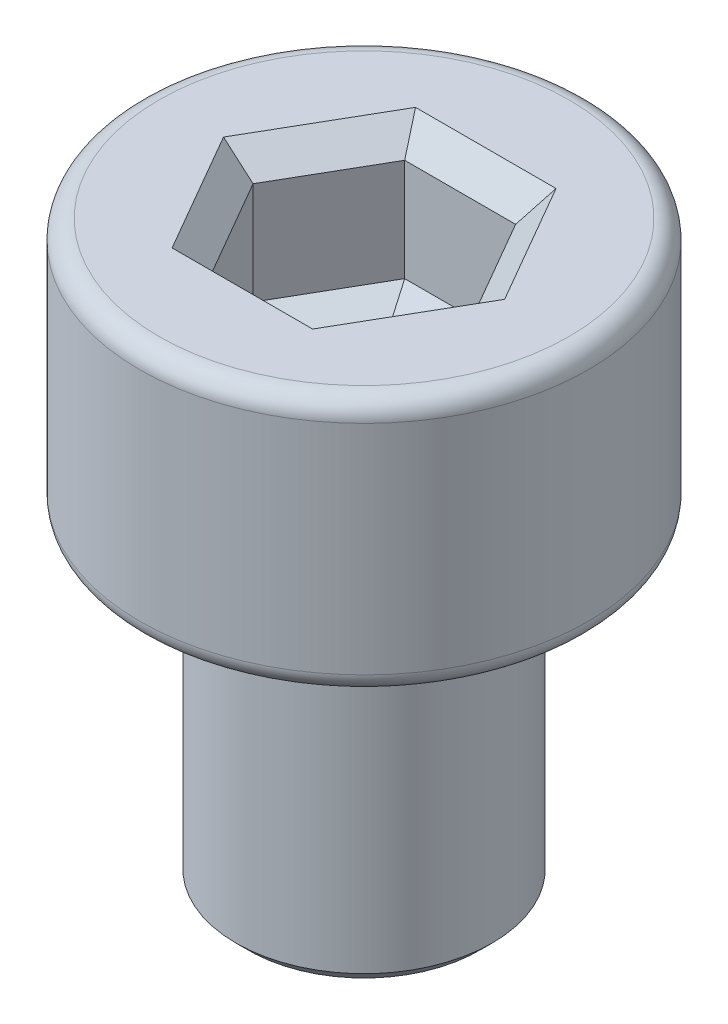
ISO-10303-21;
HEADER;
FILE_DESCRIPTION(('STEP AP214'),'2;1');
FILE_NAME('part.step','',(''),(''),'','','');
FILE_SCHEMA(('AUTOMOTIVE_DESIGN { 1 0 10303 214 1 1 1 1 }'));
ENDSEC;
DATA;
#1=APPLICATION_CONTEXT('core data for automotive mechanical design processes');
#2=APPLICATION_PROTOCOL_DEFINITION('international standard','automotive_design',2000,#1);
#3=PRODUCT_CONTEXT('',#1,'mechanical');
#4=PRODUCT('Part','Part','',(#3));
#5=PRODUCT_RELATED_PRODUCT_CATEGORY('part','',(#4));
#6=PRODUCT_DEFINITION_FORMATION('','',#4);
#7=PRODUCT_DEFINITION_CONTEXT('part definition',#1,'design');
#8=PRODUCT_DEFINITION('design','',#6,#7);
#9=PRODUCT_DEFINITION_SHAPE('','',#8);
#10=(LENGTH_UNIT() NAMED_UNIT(*) SI_UNIT(.MILLI.,.METRE.));
#11=(NAMED_UNIT(*) PLANE_ANGLE_UNIT() SI_UNIT($,.RADIAN.));
#12=(NAMED_UNIT(*) SI_UNIT($,.STERADIAN.) SOLID_ANGLE_UNIT());
#13=UNCERTAINTY_MEASURE_WITH_UNIT(LENGTH_MEASURE(1.E-05),#10,'distance_accuracy_value','');
#14=(GEOMETRIC_REPRESENTATION_CONTEXT(3) GLOBAL_UNCERTAINTY_ASSIGNED_CONTEXT((#13)) GLOBAL_UNIT_ASSIGNED_CONTEXT((#10,
#11,#12)) REPRESENTATION_CONTEXT('',''));
#15=CARTESIAN_POINT('',(0.,0.,0.));
#16=DIRECTION('',(0.,0.,1.));
#17=DIRECTION('',(1.,0.,0.));
#18=AXIS2_PLACEMENT_3D('',#15,#16,#17);
#19=CARTESIAN_POINT('',(0.,4.,0.));
#20=DIRECTION('',(0.,-1.,0.));
#21=DIRECTION('',(0.,0.,-1.));
#22=AXIS2_PLACEMENT_3D('',#19,#20,#21);
#23=CYLINDRICAL_SURFACE('',#22,3.5);
#24=CARTESIAN_POINT('',(0.,0.3,0.));
#25=DIRECTION('',(0.,1.,0.));
#26=DIRECTION('',(0.,0.,1.));
#27=AXIS2_PLACEMENT_3D('',#24,#25,#26);
#28=CIRCLE('',#27,3.5);
#29=CARTESIAN_POINT('',(0.,0.3,3.5));
#30=VERTEX_POINT('',#29);
#31=EDGE_CURVE('E217',#30,#30,#28,.T.);
#32=ORIENTED_EDGE('',*,*,#31,.T.);
#33=EDGE_LOOP('',(#32));
#34=FACE_BOUND('',#33,.T.);
#35=CARTESIAN_POINT('',(0.,3.7,0.));
#36=DIRECTION('',(0.,1.,0.));
#37=DIRECTION('',(0.,0.,1.));
#38=AXIS2_PLACEMENT_3D('',#35,#36,#37);
#39=CIRCLE('',#38,3.5);
#40=CARTESIAN_POINT('',(0.,3.7,3.5));
#41=VERTEX_POINT('',#40);
#42=EDGE_CURVE('E200',#41,#41,#39,.F.);
#43=ORIENTED_EDGE('',*,*,#42,.T.);
#44=EDGE_LOOP('',(#43));
#45=FACE_BOUND('',#44,.T.);
#46=ADVANCED_FACE('F41',(#34,#45),#23,.T.);
#47=CARTESIAN_POINT('',(0.,4.,0.));
#48=DIRECTION('',(0.,1.,0.));
#49=DIRECTION('',(0.,0.,1.));
#50=AXIS2_PLACEMENT_3D('',#47,#48,#49);
#51=PLANE('',#50);
#52=CARTESIAN_POINT('',(0.,4.,0.));
#53=DIRECTION('',(0.,1.,0.));
#54=DIRECTION('',(0.,0.,1.));
#55=AXIS2_PLACEMENT_3D('',#52,#53,#54);
#56=CIRCLE('',#55,3.2);
#57=CARTESIAN_POINT('',(0.,4.,3.2));
#58=VERTEX_POINT('',#57);
#59=EDGE_CURVE('E221',#58,#58,#56,.T.);
#60=ORIENTED_EDGE('',*,*,#59,.T.);
#61=EDGE_LOOP('',(#60));
#62=FACE_BOUND('',#61,.T.);
#63=DIRECTION('',(-0.5,0.,-0.866025403784439));
#64=VECTOR('',#63,1.);
#65=CARTESIAN_POINT('',(-2.07846096908265,4.,0.199999999999999));
#66=LINE('',#65,#64);
#67=CARTESIAN_POINT('',(-1.09696551146029,4.,1.9));
#68=VERTEX_POINT('',#67);
#69=CARTESIAN_POINT('',(-2.19393102292058,4.,0.));
#70=VERTEX_POINT('',#69);
#71=EDGE_CURVE('E180',#68,#70,#66,.T.);
#72=ORIENTED_EDGE('',*,*,#71,.T.);
#73=DIRECTION('',(0.5,0.,-0.866025403784439));
#74=VECTOR('',#73,1.);
#75=CARTESIAN_POINT('',(-1.21243556529821,4.,-1.7));
#76=LINE('',#75,#74);
#77=CARTESIAN_POINT('',(-1.09696551146029,4.,-1.9));
#78=VERTEX_POINT('',#77);
#79=EDGE_CURVE('E190',#70,#78,#76,.T.);
#80=ORIENTED_EDGE('',*,*,#79,.T.);
#81=DIRECTION('',(1.,0.,0.));
#82=VECTOR('',#81,1.);
#83=CARTESIAN_POINT('',(0.866025403784438,4.,-1.9));
#84=LINE('',#83,#82);
#85=CARTESIAN_POINT('',(1.09696551146029,4.,-1.9));
#86=VERTEX_POINT('',#85);
#87=EDGE_CURVE('E184',#78,#86,#84,.T.);
#88=ORIENTED_EDGE('',*,*,#87,.T.);
#89=DIRECTION('',(0.5,0.,0.866025403784439));
#90=VECTOR('',#89,1.);
#91=CARTESIAN_POINT('',(2.07846096908265,4.,-0.2));
#92=LINE('',#91,#90);
#93=CARTESIAN_POINT('',(2.19393102292058,4.,0.));
#94=VERTEX_POINT('',#93);
#95=EDGE_CURVE('E182',#86,#94,#92,.T.);
#96=ORIENTED_EDGE('',*,*,#95,.T.);
#97=DIRECTION('',(-0.5,0.,0.866025403784439));
#98=VECTOR('',#97,1.);
#99=CARTESIAN_POINT('',(1.21243556529821,4.,1.7));
#100=LINE('',#99,#98);
#101=CARTESIAN_POINT('',(1.09696551146029,4.,1.9));
#102=VERTEX_POINT('',#101);
#103=EDGE_CURVE('E181',#94,#102,#100,.T.);
#104=ORIENTED_EDGE('',*,*,#103,.T.);
#105=DIRECTION('',(-1.,0.,0.));
#106=VECTOR('',#105,1.);
#107=CARTESIAN_POINT('',(-0.866025403784438,4.,1.9));
#108=LINE('',#107,#106);
#109=EDGE_CURVE('E177',#102,#68,#108,.T.);
#110=ORIENTED_EDGE('',*,*,#109,.T.);
#111=EDGE_LOOP('',(#72,#80,#88,#96,#104,#110));
#112=FACE_BOUND('',#111,.T.);
#113=ADVANCED_FACE('F246',(#62,#112),#51,.T.);
#114=CARTESIAN_POINT('',(0.,0.,0.));
#115=DIRECTION('',(0.,1.,0.));
#116=DIRECTION('',(0.,0.,1.));
#117=AXIS2_PLACEMENT_3D('',#114,#115,#116);
#118=PLANE('',#117);
#119=CARTESIAN_POINT('',(0.,0.,0.));
#120=DIRECTION('',(0.,1.,0.));
#121=DIRECTION('',(0.,0.,1.));
#122=AXIS2_PLACEMENT_3D('',#119,#120,#121);
#123=CIRCLE('',#122,2.2);
#124=CARTESIAN_POINT('',(0.,0.,2.2));
#125=VERTEX_POINT('',#124);
#126=EDGE_CURVE('E226',#125,#125,#123,.T.);
#127=ORIENTED_EDGE('',*,*,#126,.T.);
#128=EDGE_LOOP('',(#127));
#129=FACE_BOUND('',#128,.T.);
#130=CARTESIAN_POINT('',(0.,0.,0.));
#131=DIRECTION('',(0.,1.,0.));
#132=DIRECTION('',(0.,0.,1.));
#133=AXIS2_PLACEMENT_3D('',#130,#131,#132);
#134=CIRCLE('',#133,3.2);
#135=CARTESIAN_POINT('',(0.,0.,3.2));
#136=VERTEX_POINT('',#135);
#137=EDGE_CURVE('E216',#136,#136,#134,.F.);
#138=ORIENTED_EDGE('',*,*,#137,.T.);
#139=EDGE_LOOP('',(#138));
#140=FACE_BOUND('',#139,.T.);
#141=ADVANCED_FACE('F254',(#129,#140),#118,.F.);
#142=CARTESIAN_POINT('',(0.866025403784438,2.,1.5));
#143=DIRECTION('',(0.866025403784439,0.,0.5));
#144=DIRECTION('',(0.5,0.,-0.866025403784439));
#145=AXIS2_PLACEMENT_3D('',#142,#143,#144);
#146=PLANE('',#145);
#147=DIRECTION('',(0.,1.,0.));
#148=VECTOR('',#147,1.);
#149=CARTESIAN_POINT('',(0.866025403784438,2.,1.5));
#150=LINE('',#149,#148);
#151=CARTESIAN_POINT('',(0.866025403784438,2.,1.5));
#152=VERTEX_POINT('',#151);
#153=CARTESIAN_POINT('',(0.866025403784438,3.6,1.5));
#154=VERTEX_POINT('',#153);
#155=EDGE_CURVE('E138',#152,#154,#150,.T.);
#156=ORIENTED_EDGE('',*,*,#155,.T.);
#157=DIRECTION('',(0.5,0.,-0.866025403784439));
#158=VECTOR('',#157,1.);
#159=CARTESIAN_POINT('',(1.73205080756888,3.6,0.));
#160=LINE('',#159,#158);
#161=CARTESIAN_POINT('',(1.73205080756888,3.6,0.));
#162=VERTEX_POINT('',#161);
#163=EDGE_CURVE('E193',#154,#162,#160,.T.);
#164=ORIENTED_EDGE('',*,*,#163,.T.);
#165=DIRECTION('',(0.,1.,0.));
#166=VECTOR('',#165,1.);
#167=CARTESIAN_POINT('',(1.73205080756888,2.,0.));
#168=LINE('',#167,#166);
#169=CARTESIAN_POINT('',(1.73205080756888,2.,0.));
#170=VERTEX_POINT('',#169);
#171=EDGE_CURVE('E139',#170,#162,#168,.T.);
#172=ORIENTED_EDGE('',*,*,#171,.F.);
#173=DIRECTION('',(0.5,0.,-0.866025403784439));
#174=VECTOR('',#173,1.);
#175=CARTESIAN_POINT('',(0.866025403784438,2.,1.5));
#176=LINE('',#175,#174);
#177=EDGE_CURVE('E121',#152,#170,#176,.T.);
#178=ORIENTED_EDGE('',*,*,#177,.F.);
#179=EDGE_LOOP('',(#156,#164,#172,#178));
#180=FACE_BOUND('',#179,.T.);
#181=ADVANCED_FACE('F146',(#180),#146,.F.);
#182=CARTESIAN_POINT('',(-0.866025403784438,2.,1.5));
#183=DIRECTION('',(0.,0.,1.));
#184=DIRECTION('',(1.,0.,0.));
#185=AXIS2_PLACEMENT_3D('',#182,#183,#184);
#186=PLANE('',#185);
#187=DIRECTION('',(0.,1.,0.));
#188=VECTOR('',#187,1.);
#189=CARTESIAN_POINT('',(-0.866025403784438,2.,1.5));
#190=LINE('',#189,#188);
#191=CARTESIAN_POINT('',(-0.866025403784438,2.,1.5));
#192=VERTEX_POINT('',#191);
#193=CARTESIAN_POINT('',(-0.866025403784438,3.6,1.5));
#194=VERTEX_POINT('',#193);
#195=EDGE_CURVE('E144',#192,#194,#190,.T.);
#196=ORIENTED_EDGE('',*,*,#195,.T.);
#197=DIRECTION('',(1.,0.,0.));
#198=VECTOR('',#197,1.);
#199=CARTESIAN_POINT('',(0.866025403784438,3.6,1.5));
#200=LINE('',#199,#198);
#201=EDGE_CURVE('E63',#194,#154,#200,.T.);
#202=ORIENTED_EDGE('',*,*,#201,.T.);
#203=ORIENTED_EDGE('',*,*,#155,.F.);
#204=DIRECTION('',(1.,0.,0.));
#205=VECTOR('',#204,1.);
#206=CARTESIAN_POINT('',(-0.866025403784438,2.,1.5));
#207=LINE('',#206,#205);
#208=EDGE_CURVE('E135',#192,#152,#207,.T.);
#209=ORIENTED_EDGE('',*,*,#208,.F.);
#210=EDGE_LOOP('',(#196,#202,#203,#209));
#211=FACE_BOUND('',#210,.T.);
#212=ADVANCED_FACE('F137',(#211),#186,.F.);
#213=CARTESIAN_POINT('',(-1.73205080756888,2.,0.));
#214=DIRECTION('',(-0.866025403784438,0.,0.5));
#215=DIRECTION('',(0.5,0.,0.866025403784439));
#216=AXIS2_PLACEMENT_3D('',#213,#214,#215);
#217=PLANE('',#216);
#218=DIRECTION('',(0.,1.,0.));
#219=VECTOR('',#218,1.);
#220=CARTESIAN_POINT('',(-1.73205080756888,2.,0.));
#221=LINE('',#220,#219);
#222=CARTESIAN_POINT('',(-1.73205080756888,2.,0.));
#223=VERTEX_POINT('',#222);
#224=CARTESIAN_POINT('',(-1.73205080756888,3.6,0.));
#225=VERTEX_POINT('',#224);
#226=EDGE_CURVE('E168',#223,#225,#221,.T.);
#227=ORIENTED_EDGE('',*,*,#226,.T.);
#228=DIRECTION('',(0.5,0.,0.866025403784439));
#229=VECTOR('',#228,1.);
#230=CARTESIAN_POINT('',(-0.866025403784438,3.6,1.5));
#231=LINE('',#230,#229);
#232=EDGE_CURVE('E60',#225,#194,#231,.T.);
#233=ORIENTED_EDGE('',*,*,#232,.T.);
#234=ORIENTED_EDGE('',*,*,#195,.F.);
#235=DIRECTION('',(0.5,0.,0.866025403784438));
#236=VECTOR('',#235,1.);
#237=CARTESIAN_POINT('',(-1.73205080756888,2.,0.));
#238=LINE('',#237,#236);
#239=EDGE_CURVE('E136',#223,#192,#238,.T.);
#240=ORIENTED_EDGE('',*,*,#239,.F.);
#241=EDGE_LOOP('',(#227,#233,#234,#240));
#242=FACE_BOUND('',#241,.T.);
#243=ADVANCED_FACE('F329',(#242),#217,.F.);
#244=CARTESIAN_POINT('',(-0.866025403784439,2.,-1.5));
#245=DIRECTION('',(-0.866025403784439,0.,-0.5));
#246=DIRECTION('',(-0.5,0.,0.866025403784439));
#247=AXIS2_PLACEMENT_3D('',#244,#245,#246);
#248=PLANE('',#247);
#249=DIRECTION('',(0.,1.,0.));
#250=VECTOR('',#249,1.);
#251=CARTESIAN_POINT('',(-0.866025403784439,2.,-1.5));
#252=LINE('',#251,#250);
#253=CARTESIAN_POINT('',(-0.866025403784439,2.,-1.5));
#254=VERTEX_POINT('',#253);
#255=CARTESIAN_POINT('',(-0.866025403784439,3.6,-1.5));
#256=VERTEX_POINT('',#255);
#257=EDGE_CURVE('E166',#254,#256,#252,.T.);
#258=ORIENTED_EDGE('',*,*,#257,.T.);
#259=DIRECTION('',(-0.5,0.,0.866025403784439));
#260=VECTOR('',#259,1.);
#261=CARTESIAN_POINT('',(-1.73205080756888,3.6,0.));
#262=LINE('',#261,#260);
#263=EDGE_CURVE('E141',#256,#225,#262,.T.);
#264=ORIENTED_EDGE('',*,*,#263,.T.);
#265=ORIENTED_EDGE('',*,*,#226,.F.);
#266=DIRECTION('',(-0.5,0.,0.866025403784439));
#267=VECTOR('',#266,1.);
#268=CARTESIAN_POINT('',(-0.866025403784439,2.,-1.5));
#269=LINE('',#268,#267);
#270=EDGE_CURVE('E163',#254,#223,#269,.T.);
#271=ORIENTED_EDGE('',*,*,#270,.F.);
#272=EDGE_LOOP('',(#258,#264,#265,#271));
#273=FACE_BOUND('',#272,.T.);
#274=ADVANCED_FACE('F324',(#273),#248,.F.);
#275=CARTESIAN_POINT('',(0.866025403784438,2.,-1.5));
#276=DIRECTION('',(0.,0.,-1.));
#277=DIRECTION('',(-1.,0.,0.));
#278=AXIS2_PLACEMENT_3D('',#275,#276,#277);
#279=PLANE('',#278);
#280=DIRECTION('',(0.,1.,0.));
#281=VECTOR('',#280,1.);
#282=CARTESIAN_POINT('',(0.866025403784438,2.,-1.5));
#283=LINE('',#282,#281);
#284=CARTESIAN_POINT('',(0.866025403784438,2.,-1.5));
#285=VERTEX_POINT('',#284);
#286=CARTESIAN_POINT('',(0.866025403784438,3.6,-1.5));
#287=VERTEX_POINT('',#286);
#288=EDGE_CURVE('E171',#285,#287,#283,.T.);
#289=ORIENTED_EDGE('',*,*,#288,.T.);
#290=DIRECTION('',(-1.,0.,0.));
#291=VECTOR('',#290,1.);
#292=CARTESIAN_POINT('',(-0.866025403784439,3.6,-1.5));
#293=LINE('',#292,#291);
#294=EDGE_CURVE('E188',#287,#256,#293,.T.);
#295=ORIENTED_EDGE('',*,*,#294,.T.);
#296=ORIENTED_EDGE('',*,*,#257,.F.);
#297=DIRECTION('',(-1.,0.,0.));
#298=VECTOR('',#297,1.);
#299=CARTESIAN_POINT('',(0.866025403784438,2.,-1.5));
#300=LINE('',#299,#298);
#301=EDGE_CURVE('E154',#285,#254,#300,.T.);
#302=ORIENTED_EDGE('',*,*,#301,.F.);
#303=EDGE_LOOP('',(#289,#295,#296,#302));
#304=FACE_BOUND('',#303,.T.);
#305=ADVANCED_FACE('F338',(#304),#279,.F.);
#306=CARTESIAN_POINT('',(1.73205080756888,2.,0.));
#307=DIRECTION('',(0.866025403784438,0.,-0.5));
#308=DIRECTION('',(-0.5,0.,-0.866025403784439));
#309=AXIS2_PLACEMENT_3D('',#306,#307,#308);
#310=PLANE('',#309);
#311=ORIENTED_EDGE('',*,*,#171,.T.);
#312=DIRECTION('',(-0.5,0.,-0.866025403784439));
#313=VECTOR('',#312,1.);
#314=CARTESIAN_POINT('',(0.866025403784438,3.6,-1.5));
#315=LINE('',#314,#313);
#316=EDGE_CURVE('E192',#162,#287,#315,.T.);
#317=ORIENTED_EDGE('',*,*,#316,.T.);
#318=ORIENTED_EDGE('',*,*,#288,.F.);
#319=DIRECTION('',(-0.5,0.,-0.866025403784438));
#320=VECTOR('',#319,1.);
#321=CARTESIAN_POINT('',(1.73205080756888,2.,0.));
#322=LINE('',#321,#320);
#323=EDGE_CURVE('E148',#170,#285,#322,.T.);
#324=ORIENTED_EDGE('',*,*,#323,.F.);
#325=EDGE_LOOP('',(#311,#317,#318,#324));
#326=FACE_BOUND('',#325,.T.);
#327=ADVANCED_FACE('F348',(#326),#310,.F.);
#328=CARTESIAN_POINT('',(-0.866025403784438,2.,1.5));
#329=DIRECTION('',(0.,-0.939692620785909,0.342020143325666));
#330=DIRECTION('',(0.,-0.342020143325666,-0.939692620785909));
#331=AXIS2_PLACEMENT_3D('',#328,#329,#330);
#332=PLANE('',#331);
#333=ORIENTED_EDGE('',*,*,#208,.T.);
#334=DIRECTION('',(0.476870962711474,0.30062657848322,0.825964736070557));
#335=VECTOR('',#334,1.);
#336=CARTESIAN_POINT('',(0.472146804928744,1.75169304744731,0.817782254767896));
#337=LINE('',#336,#335);
#338=CARTESIAN_POINT('',(0.,1.4540446486007,0.));
#339=VERTEX_POINT('',#338);
#340=EDGE_CURVE('E119',#339,#152,#337,.T.);
#341=ORIENTED_EDGE('',*,*,#340,.F.);
#342=DIRECTION('',(-0.476870962711474,0.30062657848322,0.825964736070557));
#343=VECTOR('',#342,1.);
#344=CARTESIAN_POINT('',(-0.472146804928744,1.75169304744731,0.817782254767895));
#345=LINE('',#344,#343);
#346=EDGE_CURVE('E133',#339,#192,#345,.T.);
#347=ORIENTED_EDGE('',*,*,#346,.T.);
#348=EDGE_LOOP('',(#333,#341,#347));
#349=FACE_BOUND('',#348,.T.);
#350=ADVANCED_FACE('F131',(#349),#332,.F.);
#351=CARTESIAN_POINT('',(-1.73205080756888,2.,0.));
#352=DIRECTION('',(-0.296198132726022,-0.939692620785909,0.171010071662833));
#353=DIRECTION('',(0.953741925422948,-0.30062657848322,0.));
#354=AXIS2_PLACEMENT_3D('',#351,#352,#353);
#355=PLANE('',#354);
#356=ORIENTED_EDGE('',*,*,#239,.T.);
#357=ORIENTED_EDGE('',*,*,#346,.F.);
#358=DIRECTION('',(-0.953741925422948,0.30062657848322,0.));
#359=VECTOR('',#358,1.);
#360=CARTESIAN_POINT('',(-0.944293609857488,1.75169304744731,0.));
#361=LINE('',#360,#359);
#362=EDGE_CURVE('E151',#339,#223,#361,.T.);
#363=ORIENTED_EDGE('',*,*,#362,.T.);
#364=EDGE_LOOP('',(#356,#357,#363));
#365=FACE_BOUND('',#364,.T.);
#366=ADVANCED_FACE('F326',(#365),#355,.F.);
#367=CARTESIAN_POINT('',(-0.866025403784439,2.,-1.5));
#368=DIRECTION('',(-0.296198132726022,-0.939692620785909,-0.171010071662833));
#369=DIRECTION('',(0.953741925422948,-0.30062657848322,0.));
#370=AXIS2_PLACEMENT_3D('',#367,#368,#369);
#371=PLANE('',#370);
#372=ORIENTED_EDGE('',*,*,#270,.T.);
#373=ORIENTED_EDGE('',*,*,#362,.F.);
#374=DIRECTION('',(-0.476870962711474,0.30062657848322,-0.825964736070557));
#375=VECTOR('',#374,1.);
#376=CARTESIAN_POINT('',(-0.472146804928745,1.75169304744731,-0.817782254767896));
#377=LINE('',#376,#375);
#378=EDGE_CURVE('E331',#339,#254,#377,.T.);
#379=ORIENTED_EDGE('',*,*,#378,.T.);
#380=EDGE_LOOP('',(#372,#373,#379));
#381=FACE_BOUND('',#380,.T.);
#382=ADVANCED_FACE('F335',(#381),#371,.F.);
#383=CARTESIAN_POINT('',(0.866025403784438,2.,-1.5));
#384=DIRECTION('',(0.,-0.939692620785909,-0.342020143325666));
#385=DIRECTION('',(0.,0.342020143325666,-0.939692620785909));
#386=AXIS2_PLACEMENT_3D('',#383,#384,#385);
#387=PLANE('',#386);
#388=ORIENTED_EDGE('',*,*,#301,.T.);
#389=ORIENTED_EDGE('',*,*,#378,.F.);
#390=DIRECTION('',(0.476870962711474,0.30062657848322,-0.825964736070557));
#391=VECTOR('',#390,1.);
#392=CARTESIAN_POINT('',(0.472146804928743,1.75169304744731,-0.817782254767896));
#393=LINE('',#392,#391);
#394=EDGE_CURVE('E337',#339,#285,#393,.T.);
#395=ORIENTED_EDGE('',*,*,#394,.T.);
#396=EDGE_LOOP('',(#388,#389,#395));
#397=FACE_BOUND('',#396,.T.);
#398=ADVANCED_FACE('F336',(#397),#387,.F.);
#399=CARTESIAN_POINT('',(1.73205080756888,2.,0.));
#400=DIRECTION('',(0.296198132726022,-0.939692620785909,-0.171010071662833));
#401=DIRECTION('',(0.953741925422948,0.30062657848322,0.));
#402=AXIS2_PLACEMENT_3D('',#399,#400,#401);
#403=PLANE('',#402);
#404=ORIENTED_EDGE('',*,*,#323,.T.);
#405=ORIENTED_EDGE('',*,*,#394,.F.);
#406=DIRECTION('',(0.953741925422948,0.30062657848322,0.));
#407=VECTOR('',#406,1.);
#408=CARTESIAN_POINT('',(0.944293609857487,1.75169304744731,0.));
#409=LINE('',#408,#407);
#410=EDGE_CURVE('E126',#339,#170,#409,.T.);
#411=ORIENTED_EDGE('',*,*,#410,.T.);
#412=EDGE_LOOP('',(#404,#405,#411));
#413=FACE_BOUND('',#412,.T.);
#414=ADVANCED_FACE('F351',(#413),#403,.F.);
#415=CARTESIAN_POINT('',(0.866025403784438,2.,1.5));
#416=DIRECTION('',(0.296198132726022,-0.939692620785909,0.171010071662833));
#417=DIRECTION('',(0.953741925422948,0.30062657848322,0.));
#418=AXIS2_PLACEMENT_3D('',#415,#416,#417);
#419=PLANE('',#418);
#420=ORIENTED_EDGE('',*,*,#177,.T.);
#421=ORIENTED_EDGE('',*,*,#410,.F.);
#422=ORIENTED_EDGE('',*,*,#340,.T.);
#423=EDGE_LOOP('',(#420,#421,#422));
#424=FACE_BOUND('',#423,.T.);
#425=ADVANCED_FACE('F125',(#424),#419,.F.);
#426=CARTESIAN_POINT('',(0.,-5.,0.));
#427=DIRECTION('',(0.,1.,0.));
#428=DIRECTION('',(0.,0.,1.));
#429=AXIS2_PLACEMENT_3D('',#426,#427,#428);
#430=CYLINDRICAL_SURFACE('',#429,2.);
#431=CARTESIAN_POINT('',(0.,-4.8,0.));
#432=DIRECTION('',(0.,-1.,0.));
#433=DIRECTION('',(0.,0.,-1.));
#434=AXIS2_PLACEMENT_3D('',#431,#432,#433);
#435=CIRCLE('',#434,2.);
#436=CARTESIAN_POINT('',(0.,-4.8,-2.));
#437=VERTEX_POINT('',#436);
#438=EDGE_CURVE('E11',#437,#437,#435,.F.);
#439=ORIENTED_EDGE('',*,*,#438,.T.);
#440=EDGE_LOOP('',(#439));
#441=FACE_BOUND('',#440,.T.);
#442=CARTESIAN_POINT('',(0.,-0.2,0.));
#443=DIRECTION('',(0.,1.,0.));
#444=DIRECTION('',(0.,0.,1.));
#445=AXIS2_PLACEMENT_3D('',#442,#443,#444);
#446=CIRCLE('',#445,2.);
#447=CARTESIAN_POINT('',(0.,-0.2,2.));
#448=VERTEX_POINT('',#447);
#449=EDGE_CURVE('E222',#448,#448,#446,.F.);
#450=ORIENTED_EDGE('',*,*,#449,.T.);
#451=EDGE_LOOP('',(#450));
#452=FACE_BOUND('',#451,.T.);
#453=ADVANCED_FACE('F363',(#441,#452),#430,.T.);
#454=CARTESIAN_POINT('',(0.,-5.,0.));
#455=DIRECTION('',(0.,-1.,0.));
#456=DIRECTION('',(0.,0.,-1.));
#457=AXIS2_PLACEMENT_3D('',#454,#455,#456);
#458=PLANE('',#457);
#459=CARTESIAN_POINT('',(0.,-5.,0.));
#460=DIRECTION('',(0.,-1.,0.));
#461=DIRECTION('',(0.,0.,-1.));
#462=AXIS2_PLACEMENT_3D('',#459,#460,#461);
#463=CIRCLE('',#462,1.8);
#464=CARTESIAN_POINT('',(0.,-5.,-1.8));
#465=VERTEX_POINT('',#464);
#466=EDGE_CURVE('E49',#465,#465,#463,.T.);
#467=ORIENTED_EDGE('',*,*,#466,.T.);
#468=EDGE_LOOP('',(#467));
#469=FACE_BOUND('',#468,.T.);
#470=ADVANCED_FACE('F231',(#469),#458,.T.);
#471=CARTESIAN_POINT('',(0.866025403784438,3.6,1.5));
#472=DIRECTION('',(-0.612372435695793,0.70710678118655,-0.353553390593273));
#473=DIRECTION('',(-0.5,0.,0.866025403784439));
#474=AXIS2_PLACEMENT_3D('',#471,#472,#473);
#475=PLANE('',#474);
#476=DIRECTION('',(-0.377964473009229,-0.654653670707975,-0.654653670707978));
#477=VECTOR('',#476,1.);
#478=CARTESIAN_POINT('',(0.866025403784438,3.6,1.5));
#479=LINE('',#478,#477);
#480=EDGE_CURVE('E209',#102,#154,#479,.T.);
#481=ORIENTED_EDGE('',*,*,#480,.F.);
#482=ORIENTED_EDGE('',*,*,#103,.F.);
#483=DIRECTION('',(-0.755928946018456,-0.654653670707975,0.));
#484=VECTOR('',#483,1.);
#485=CARTESIAN_POINT('',(1.73205080756888,3.6,0.));
#486=LINE('',#485,#484);
#487=EDGE_CURVE('E130',#162,#94,#486,.F.);
#488=ORIENTED_EDGE('',*,*,#487,.F.);
#489=ORIENTED_EDGE('',*,*,#163,.F.);
#490=EDGE_LOOP('',(#481,#482,#488,#489));
#491=FACE_BOUND('',#490,.T.);
#492=ADVANCED_FACE('F295',(#491),#475,.T.);
#493=CARTESIAN_POINT('',(1.73205080756888,3.6,0.));
#494=DIRECTION('',(-0.612372435695793,0.707106781186549,0.353553390593273));
#495=DIRECTION('',(0.5,0.,0.866025403784439));
#496=AXIS2_PLACEMENT_3D('',#493,#494,#495);
#497=PLANE('',#496);
#498=ORIENTED_EDGE('',*,*,#487,.T.);
#499=ORIENTED_EDGE('',*,*,#95,.F.);
#500=DIRECTION('',(-0.377964473009228,-0.654653670707976,0.654653670707979));
#501=VECTOR('',#500,1.);
#502=CARTESIAN_POINT('',(0.866025403784438,3.6,-1.5));
#503=LINE('',#502,#501);
#504=EDGE_CURVE('E207',#287,#86,#503,.F.);
#505=ORIENTED_EDGE('',*,*,#504,.F.);
#506=ORIENTED_EDGE('',*,*,#316,.F.);
#507=EDGE_LOOP('',(#498,#499,#505,#506));
#508=FACE_BOUND('',#507,.T.);
#509=ADVANCED_FACE('F286',(#508),#497,.T.);
#510=CARTESIAN_POINT('',(-0.866025403784438,3.6,1.5));
#511=DIRECTION('',(0.,0.707106781186549,-0.707106781186546));
#512=DIRECTION('',(-1.,0.,0.));
#513=AXIS2_PLACEMENT_3D('',#510,#511,#512);
#514=PLANE('',#513);
#515=ORIENTED_EDGE('',*,*,#480,.T.);
#516=ORIENTED_EDGE('',*,*,#201,.F.);
#517=DIRECTION('',(0.377964473009228,-0.654653670707975,-0.654653670707978));
#518=VECTOR('',#517,1.);
#519=CARTESIAN_POINT('',(-0.866025403784438,3.6,1.5));
#520=LINE('',#519,#518);
#521=EDGE_CURVE('E205',#68,#194,#520,.T.);
#522=ORIENTED_EDGE('',*,*,#521,.F.);
#523=ORIENTED_EDGE('',*,*,#109,.F.);
#524=EDGE_LOOP('',(#515,#516,#522,#523));
#525=FACE_BOUND('',#524,.T.);
#526=ADVANCED_FACE('F280',(#525),#514,.T.);
#527=CARTESIAN_POINT('',(0.866025403784438,3.6,-1.5));
#528=DIRECTION('',(0.,0.707106781186549,0.707106781186546));
#529=DIRECTION('',(1.,0.,0.));
#530=AXIS2_PLACEMENT_3D('',#527,#528,#529);
#531=PLANE('',#530);
#532=ORIENTED_EDGE('',*,*,#504,.T.);
#533=ORIENTED_EDGE('',*,*,#87,.F.);
#534=DIRECTION('',(0.377964473009228,-0.654653670707975,0.654653670707978));
#535=VECTOR('',#534,1.);
#536=CARTESIAN_POINT('',(-0.866025403784439,3.6,-1.5));
#537=LINE('',#536,#535);
#538=EDGE_CURVE('E204',#256,#78,#537,.F.);
#539=ORIENTED_EDGE('',*,*,#538,.F.);
#540=ORIENTED_EDGE('',*,*,#294,.F.);
#541=EDGE_LOOP('',(#532,#533,#539,#540));
#542=FACE_BOUND('',#541,.T.);
#543=ADVANCED_FACE('F271',(#542),#531,.T.);
#544=CARTESIAN_POINT('',(-1.73205080756888,3.6,0.));
#545=DIRECTION('',(0.612372435695793,0.707106781186549,-0.353553390593273));
#546=DIRECTION('',(-0.5,0.,-0.866025403784439));
#547=AXIS2_PLACEMENT_3D('',#544,#545,#546);
#548=PLANE('',#547);
#549=ORIENTED_EDGE('',*,*,#521,.T.);
#550=ORIENTED_EDGE('',*,*,#232,.F.);
#551=DIRECTION('',(-0.755928946018456,0.654653670707975,0.));
#552=VECTOR('',#551,1.);
#553=CARTESIAN_POINT('',(-1.23717914826348,3.17142857142857,0.));
#554=LINE('',#553,#552);
#555=EDGE_CURVE('E196',#70,#225,#554,.F.);
#556=ORIENTED_EDGE('',*,*,#555,.F.);
#557=ORIENTED_EDGE('',*,*,#71,.F.);
#558=EDGE_LOOP('',(#549,#550,#556,#557));
#559=FACE_BOUND('',#558,.T.);
#560=ADVANCED_FACE('F269',(#559),#548,.T.);
#561=CARTESIAN_POINT('',(-0.866025403784439,3.6,-1.5));
#562=DIRECTION('',(0.612372435695793,0.707106781186549,0.353553390593273));
#563=DIRECTION('',(0.5,0.,-0.866025403784439));
#564=AXIS2_PLACEMENT_3D('',#561,#562,#563);
#565=PLANE('',#564);
#566=ORIENTED_EDGE('',*,*,#538,.T.);
#567=ORIENTED_EDGE('',*,*,#79,.F.);
#568=ORIENTED_EDGE('',*,*,#555,.T.);
#569=ORIENTED_EDGE('',*,*,#263,.F.);
#570=EDGE_LOOP('',(#566,#567,#568,#569));
#571=FACE_BOUND('',#570,.T.);
#572=ADVANCED_FACE('F260',(#571),#565,.T.);
#573=CARTESIAN_POINT('',(0.,0.3,0.));
#574=DIRECTION('',(0.,1.,0.));
#575=DIRECTION('',(0.,0.,1.));
#576=AXIS2_PLACEMENT_3D('',#573,#574,#575);
#577=TOROIDAL_SURFACE('',#576,3.2,0.3);
#578=ORIENTED_EDGE('',*,*,#137,.F.);
#579=EDGE_LOOP('',(#578));
#580=FACE_BOUND('',#579,.T.);
#581=ORIENTED_EDGE('',*,*,#31,.F.);
#582=EDGE_LOOP('',(#581));
#583=FACE_BOUND('',#582,.T.);
#584=ADVANCED_FACE('F263',(#580,#583),#577,.T.);
#585=CARTESIAN_POINT('',(0.,3.7,0.));
#586=DIRECTION('',(0.,1.,0.));
#587=DIRECTION('',(0.,0.,1.));
#588=AXIS2_PLACEMENT_3D('',#585,#586,#587);
#589=TOROIDAL_SURFACE('',#588,3.2,0.3);
#590=ORIENTED_EDGE('',*,*,#42,.F.);
#591=EDGE_LOOP('',(#590));
#592=FACE_BOUND('',#591,.T.);
#593=ORIENTED_EDGE('',*,*,#59,.F.);
#594=EDGE_LOOP('',(#593));
#595=FACE_BOUND('',#594,.T.);
#596=ADVANCED_FACE('F245',(#592,#595),#589,.T.);
#597=CARTESIAN_POINT('',(0.,-0.2,0.));
#598=DIRECTION('',(0.,1.,0.));
#599=DIRECTION('',(0.,0.,1.));
#600=AXIS2_PLACEMENT_3D('',#597,#598,#599);
#601=TOROIDAL_SURFACE('',#600,2.2,0.2);
#602=ORIENTED_EDGE('',*,*,#126,.F.);
#603=EDGE_LOOP('',(#602));
#604=FACE_BOUND('',#603,.T.);
#605=ORIENTED_EDGE('',*,*,#449,.F.);
#606=EDGE_LOOP('',(#605));
#607=FACE_BOUND('',#606,.T.);
#608=ADVANCED_FACE('F236',(#604,#607),#601,.F.);
#609=CARTESIAN_POINT('',(0.,-5.,0.));
#610=DIRECTION('',(0.,1.,0.));
#611=DIRECTION('',(0.,0.,1.));
#612=AXIS2_PLACEMENT_3D('',#609,#610,#611);
#613=CONICAL_SURFACE('',#612,1.8,0.785398163397444);
#614=ORIENTED_EDGE('',*,*,#438,.F.);
#615=EDGE_LOOP('',(#614));
#616=FACE_BOUND('',#615,.T.);
#617=ORIENTED_EDGE('',*,*,#466,.F.);
#618=EDGE_LOOP('',(#617));
#619=FACE_BOUND('',#618,.T.);
#620=ADVANCED_FACE('F42',(#616,#619),#613,.T.);
#621=CLOSED_SHELL('',(#46,#113,#141,#181,#212,#243,#274,#305,#327,#350,#366,#382,#398,#414,#425,
#453,#470,#492,#509,#526,#543,#560,#572,#584,#596,#608,#620));
#622=MANIFOLD_SOLID_BREP('B2',#621);
#623=ADVANCED_BREP_SHAPE_REPRESENTATION('',(#18,#622),#14);
#624=SHAPE_DEFINITION_REPRESENTATION(#9,#623);
ENDSEC;
END-ISO-10303-21;
